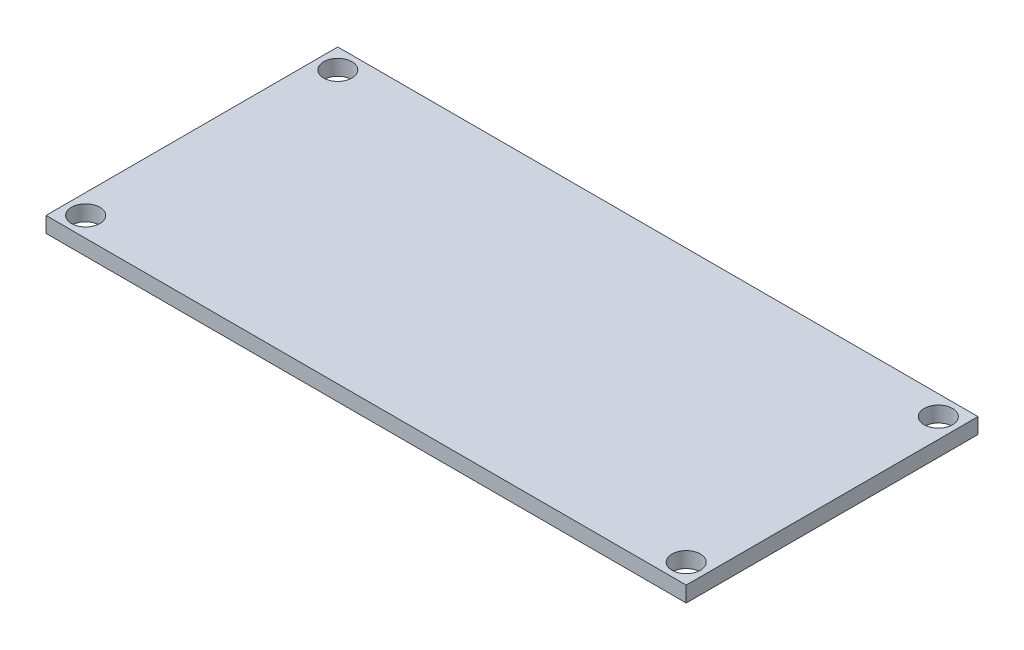
ISO-10303-21;
HEADER;
FILE_DESCRIPTION(('STEP AP214'),'2;1');
FILE_NAME('part.step','',(''),(''),'','','');
FILE_SCHEMA(('AUTOMOTIVE_DESIGN { 1 0 10303 214 1 1 1 1 }'));
ENDSEC;
DATA;
#1=APPLICATION_CONTEXT('core data for automotive mechanical design processes');
#2=APPLICATION_PROTOCOL_DEFINITION('international standard','automotive_design',2000,#1);
#3=PRODUCT_CONTEXT('',#1,'mechanical');
#4=PRODUCT('Part','Part','',(#3));
#5=PRODUCT_RELATED_PRODUCT_CATEGORY('part','',(#4));
#6=PRODUCT_DEFINITION_FORMATION('','',#4);
#7=PRODUCT_DEFINITION_CONTEXT('part definition',#1,'design');
#8=PRODUCT_DEFINITION('design','',#6,#7);
#9=PRODUCT_DEFINITION_SHAPE('','',#8);
#10=(LENGTH_UNIT() NAMED_UNIT(*) SI_UNIT(.MILLI.,.METRE.));
#11=(NAMED_UNIT(*) PLANE_ANGLE_UNIT() SI_UNIT($,.RADIAN.));
#12=(NAMED_UNIT(*) SI_UNIT($,.STERADIAN.) SOLID_ANGLE_UNIT());
#13=UNCERTAINTY_MEASURE_WITH_UNIT(LENGTH_MEASURE(1.E-05),#10,'distance_accuracy_value','');
#14=(GEOMETRIC_REPRESENTATION_CONTEXT(3) GLOBAL_UNCERTAINTY_ASSIGNED_CONTEXT((#13)) GLOBAL_UNIT_ASSIGNED_CONTEXT((#10,
#11,#12)) REPRESENTATION_CONTEXT('',''));
#15=CARTESIAN_POINT('',(0.,0.,0.));
#16=DIRECTION('',(0.,0.,1.));
#17=DIRECTION('',(1.,0.,0.));
#18=AXIS2_PLACEMENT_3D('',#15,#16,#17);
#19=CARTESIAN_POINT('',(-22.6,1.1,10.3));
#20=DIRECTION('',(1.,0.,0.));
#21=DIRECTION('',(0.,0.,-1.));
#22=AXIS2_PLACEMENT_3D('',#19,#20,#21);
#23=PLANE('',#22);
#24=DIRECTION('',(0.,0.,1.));
#25=VECTOR('',#24,1.);
#26=CARTESIAN_POINT('',(-22.6,0.,10.3));
#27=LINE('',#26,#25);
#28=CARTESIAN_POINT('',(-22.6,0.,-10.3));
#29=VERTEX_POINT('',#28);
#30=CARTESIAN_POINT('',(-22.6,0.,10.3));
#31=VERTEX_POINT('',#30);
#32=EDGE_CURVE('E102',#29,#31,#27,.T.);
#33=ORIENTED_EDGE('',*,*,#32,.T.);
#34=DIRECTION('',(0.,-1.,0.));
#35=VECTOR('',#34,1.);
#36=CARTESIAN_POINT('',(-22.6,1.1,10.3));
#37=LINE('',#36,#35);
#38=CARTESIAN_POINT('',(-22.6,1.1,10.3));
#39=VERTEX_POINT('',#38);
#40=EDGE_CURVE('E11',#39,#31,#37,.T.);
#41=ORIENTED_EDGE('',*,*,#40,.F.);
#42=DIRECTION('',(0.,0.,1.));
#43=VECTOR('',#42,1.);
#44=CARTESIAN_POINT('',(-22.6,1.1,10.3));
#45=LINE('',#44,#43);
#46=CARTESIAN_POINT('',(-22.6,1.1,-10.3));
#47=VERTEX_POINT('',#46);
#48=EDGE_CURVE('E90',#47,#39,#45,.T.);
#49=ORIENTED_EDGE('',*,*,#48,.F.);
#50=DIRECTION('',(0.,-1.,0.));
#51=VECTOR('',#50,1.);
#52=CARTESIAN_POINT('',(-22.6,1.1,-10.3));
#53=LINE('',#52,#51);
#54=EDGE_CURVE('E98',#47,#29,#53,.T.);
#55=ORIENTED_EDGE('',*,*,#54,.T.);
#56=EDGE_LOOP('',(#33,#41,#49,#55));
#57=FACE_BOUND('',#56,.T.);
#58=ADVANCED_FACE('F39',(#57),#23,.F.);
#59=CARTESIAN_POINT('',(22.6,1.1,10.3));
#60=DIRECTION('',(0.,0.,-1.));
#61=DIRECTION('',(-1.,0.,0.));
#62=AXIS2_PLACEMENT_3D('',#59,#60,#61);
#63=PLANE('',#62);
#64=DIRECTION('',(1.,0.,0.));
#65=VECTOR('',#64,1.);
#66=CARTESIAN_POINT('',(22.6,0.,10.3));
#67=LINE('',#66,#65);
#68=CARTESIAN_POINT('',(22.6,0.,10.3));
#69=VERTEX_POINT('',#68);
#70=EDGE_CURVE('E94',#31,#69,#67,.T.);
#71=ORIENTED_EDGE('',*,*,#70,.T.);
#72=DIRECTION('',(0.,-1.,0.));
#73=VECTOR('',#72,1.);
#74=CARTESIAN_POINT('',(22.6,1.1,10.3));
#75=LINE('',#74,#73);
#76=CARTESIAN_POINT('',(22.6,1.1,10.3));
#77=VERTEX_POINT('',#76);
#78=EDGE_CURVE('E47',#77,#69,#75,.T.);
#79=ORIENTED_EDGE('',*,*,#78,.F.);
#80=DIRECTION('',(1.,0.,0.));
#81=VECTOR('',#80,1.);
#82=CARTESIAN_POINT('',(22.6,1.1,10.3));
#83=LINE('',#82,#81);
#84=EDGE_CURVE('E85',#39,#77,#83,.T.);
#85=ORIENTED_EDGE('',*,*,#84,.F.);
#86=ORIENTED_EDGE('',*,*,#40,.T.);
#87=EDGE_LOOP('',(#71,#79,#85,#86));
#88=FACE_BOUND('',#87,.T.);
#89=ADVANCED_FACE('F93',(#88),#63,.F.);
#90=CARTESIAN_POINT('',(22.6,1.1,10.3));
#91=DIRECTION('',(-1.,0.,0.));
#92=DIRECTION('',(0.,0.,1.));
#93=AXIS2_PLACEMENT_3D('',#90,#91,#92);
#94=PLANE('',#93);
#95=DIRECTION('',(0.,0.,-1.));
#96=VECTOR('',#95,1.);
#97=CARTESIAN_POINT('',(22.6,0.,10.3));
#98=LINE('',#97,#96);
#99=CARTESIAN_POINT('',(22.6,0.,-10.3));
#100=VERTEX_POINT('',#99);
#101=EDGE_CURVE('E72',#69,#100,#98,.T.);
#102=ORIENTED_EDGE('',*,*,#101,.T.);
#103=DIRECTION('',(0.,-1.,0.));
#104=VECTOR('',#103,1.);
#105=CARTESIAN_POINT('',(22.6,1.1,-10.3));
#106=LINE('',#105,#104);
#107=CARTESIAN_POINT('',(22.6,1.1,-10.3));
#108=VERTEX_POINT('',#107);
#109=EDGE_CURVE('E95',#108,#100,#106,.T.);
#110=ORIENTED_EDGE('',*,*,#109,.F.);
#111=DIRECTION('',(0.,0.,-1.));
#112=VECTOR('',#111,1.);
#113=CARTESIAN_POINT('',(22.6,1.1,10.3));
#114=LINE('',#113,#112);
#115=EDGE_CURVE('E88',#77,#108,#114,.T.);
#116=ORIENTED_EDGE('',*,*,#115,.F.);
#117=ORIENTED_EDGE('',*,*,#78,.T.);
#118=EDGE_LOOP('',(#102,#110,#116,#117));
#119=FACE_BOUND('',#118,.T.);
#120=ADVANCED_FACE('F96',(#119),#94,.F.);
#121=CARTESIAN_POINT('',(22.6,1.1,-10.3));
#122=DIRECTION('',(0.,0.,1.));
#123=DIRECTION('',(1.,0.,0.));
#124=AXIS2_PLACEMENT_3D('',#121,#122,#123);
#125=PLANE('',#124);
#126=DIRECTION('',(-1.,0.,0.));
#127=VECTOR('',#126,1.);
#128=CARTESIAN_POINT('',(22.6,0.,-10.3));
#129=LINE('',#128,#127);
#130=EDGE_CURVE('E78',#100,#29,#129,.T.);
#131=ORIENTED_EDGE('',*,*,#130,.T.);
#132=ORIENTED_EDGE('',*,*,#54,.F.);
#133=DIRECTION('',(-1.,0.,0.));
#134=VECTOR('',#133,1.);
#135=CARTESIAN_POINT('',(22.6,1.1,-10.3));
#136=LINE('',#135,#134);
#137=EDGE_CURVE('E55',#108,#47,#136,.T.);
#138=ORIENTED_EDGE('',*,*,#137,.F.);
#139=ORIENTED_EDGE('',*,*,#109,.T.);
#140=EDGE_LOOP('',(#131,#132,#138,#139));
#141=FACE_BOUND('',#140,.T.);
#142=ADVANCED_FACE('F110',(#141),#125,.F.);
#143=CARTESIAN_POINT('',(0.,1.1,0.));
#144=DIRECTION('',(0.,1.,0.));
#145=DIRECTION('',(0.,0.,1.));
#146=AXIS2_PLACEMENT_3D('',#143,#144,#145);
#147=PLANE('',#146);
#148=CARTESIAN_POINT('',(-21.2,1.1,-8.90000000000001));
#149=DIRECTION('',(0.,-1.,0.));
#150=DIRECTION('',(0.,0.,1.));
#151=AXIS2_PLACEMENT_3D('',#148,#149,#150);
#152=CIRCLE('',#151,1.);
#153=CARTESIAN_POINT('',(-21.2,1.1,-7.90000000000001));
#154=VERTEX_POINT('',#153);
#155=EDGE_CURVE('E134',#154,#154,#152,.T.);
#156=ORIENTED_EDGE('',*,*,#155,.T.);
#157=EDGE_LOOP('',(#156));
#158=FACE_BOUND('',#157,.T.);
#159=CARTESIAN_POINT('',(21.2,1.1,8.90000000000001));
#160=DIRECTION('',(0.,-1.,0.));
#161=DIRECTION('',(0.,0.,1.));
#162=AXIS2_PLACEMENT_3D('',#159,#160,#161);
#163=CIRCLE('',#162,1.);
#164=CARTESIAN_POINT('',(21.2,1.1,9.90000000000001));
#165=VERTEX_POINT('',#164);
#166=EDGE_CURVE('E128',#165,#165,#163,.T.);
#167=ORIENTED_EDGE('',*,*,#166,.T.);
#168=EDGE_LOOP('',(#167));
#169=FACE_BOUND('',#168,.T.);
#170=CARTESIAN_POINT('',(21.2,1.1,-8.90000000000001));
#171=DIRECTION('',(0.,1.,0.));
#172=DIRECTION('',(0.,0.,1.));
#173=AXIS2_PLACEMENT_3D('',#170,#171,#172);
#174=CIRCLE('',#173,1.);
#175=CARTESIAN_POINT('',(21.2,1.1,-7.90000000000001));
#176=VERTEX_POINT('',#175);
#177=EDGE_CURVE('E123',#176,#176,#174,.T.);
#178=ORIENTED_EDGE('',*,*,#177,.F.);
#179=EDGE_LOOP('',(#178));
#180=FACE_BOUND('',#179,.T.);
#181=CARTESIAN_POINT('',(-21.2,1.1,8.90000000000001));
#182=DIRECTION('',(0.,1.,0.));
#183=DIRECTION('',(0.,0.,1.));
#184=AXIS2_PLACEMENT_3D('',#181,#182,#183);
#185=CIRCLE('',#184,1.);
#186=CARTESIAN_POINT('',(-21.2,1.1,9.90000000000001));
#187=VERTEX_POINT('',#186);
#188=EDGE_CURVE('E116',#187,#187,#185,.T.);
#189=ORIENTED_EDGE('',*,*,#188,.F.);
#190=EDGE_LOOP('',(#189));
#191=FACE_BOUND('',#190,.T.);
#192=ORIENTED_EDGE('',*,*,#48,.T.);
#193=ORIENTED_EDGE('',*,*,#84,.T.);
#194=ORIENTED_EDGE('',*,*,#115,.T.);
#195=ORIENTED_EDGE('',*,*,#137,.T.);
#196=EDGE_LOOP('',(#192,#193,#194,#195));
#197=FACE_BOUND('',#196,.T.);
#198=ADVANCED_FACE('F86',(#158,#169,#180,#191,#197),#147,.T.);
#199=CARTESIAN_POINT('',(0.,0.,0.));
#200=DIRECTION('',(0.,1.,0.));
#201=DIRECTION('',(0.,0.,1.));
#202=AXIS2_PLACEMENT_3D('',#199,#200,#201);
#203=PLANE('',#202);
#204=CARTESIAN_POINT('',(-21.2,0.,-8.90000000000001));
#205=DIRECTION('',(0.,-1.,0.));
#206=DIRECTION('',(0.,0.,1.));
#207=AXIS2_PLACEMENT_3D('',#204,#205,#206);
#208=CIRCLE('',#207,1.);
#209=CARTESIAN_POINT('',(-21.2,0.,-7.90000000000001));
#210=VERTEX_POINT('',#209);
#211=EDGE_CURVE('E120',#210,#210,#208,.T.);
#212=ORIENTED_EDGE('',*,*,#211,.F.);
#213=EDGE_LOOP('',(#212));
#214=FACE_BOUND('',#213,.T.);
#215=CARTESIAN_POINT('',(21.2,0.,8.90000000000001));
#216=DIRECTION('',(0.,-1.,0.));
#217=DIRECTION('',(0.,0.,1.));
#218=AXIS2_PLACEMENT_3D('',#215,#216,#217);
#219=CIRCLE('',#218,1.);
#220=CARTESIAN_POINT('',(21.2,0.,9.90000000000001));
#221=VERTEX_POINT('',#220);
#222=EDGE_CURVE('E131',#221,#221,#219,.T.);
#223=ORIENTED_EDGE('',*,*,#222,.F.);
#224=EDGE_LOOP('',(#223));
#225=FACE_BOUND('',#224,.T.);
#226=CARTESIAN_POINT('',(21.2,0.,-8.90000000000001));
#227=DIRECTION('',(0.,1.,0.));
#228=DIRECTION('',(0.,0.,1.));
#229=AXIS2_PLACEMENT_3D('',#226,#227,#228);
#230=CIRCLE('',#229,1.);
#231=CARTESIAN_POINT('',(21.2,0.,-7.90000000000001));
#232=VERTEX_POINT('',#231);
#233=EDGE_CURVE('E105',#232,#232,#230,.T.);
#234=ORIENTED_EDGE('',*,*,#233,.T.);
#235=EDGE_LOOP('',(#234));
#236=FACE_BOUND('',#235,.T.);
#237=CARTESIAN_POINT('',(-21.2,0.,8.90000000000001));
#238=DIRECTION('',(0.,1.,0.));
#239=DIRECTION('',(0.,0.,1.));
#240=AXIS2_PLACEMENT_3D('',#237,#238,#239);
#241=CIRCLE('',#240,1.);
#242=CARTESIAN_POINT('',(-21.2,0.,9.90000000000001));
#243=VERTEX_POINT('',#242);
#244=EDGE_CURVE('E119',#243,#243,#241,.T.);
#245=ORIENTED_EDGE('',*,*,#244,.T.);
#246=EDGE_LOOP('',(#245));
#247=FACE_BOUND('',#246,.T.);
#248=ORIENTED_EDGE('',*,*,#32,.F.);
#249=ORIENTED_EDGE('',*,*,#130,.F.);
#250=ORIENTED_EDGE('',*,*,#101,.F.);
#251=ORIENTED_EDGE('',*,*,#70,.F.);
#252=EDGE_LOOP('',(#248,#249,#250,#251));
#253=FACE_BOUND('',#252,.T.);
#254=ADVANCED_FACE('F113',(#214,#225,#236,#247,#253),#203,.F.);
#255=CARTESIAN_POINT('',(-21.2,0.,8.90000000000001));
#256=DIRECTION('',(0.,1.,0.));
#257=DIRECTION('',(0.,0.,1.));
#258=AXIS2_PLACEMENT_3D('',#255,#256,#257);
#259=CYLINDRICAL_SURFACE('',#258,1.);
#260=ORIENTED_EDGE('',*,*,#244,.F.);
#261=EDGE_LOOP('',(#260));
#262=FACE_BOUND('',#261,.T.);
#263=ORIENTED_EDGE('',*,*,#188,.T.);
#264=EDGE_LOOP('',(#263));
#265=FACE_BOUND('',#264,.T.);
#266=ADVANCED_FACE('F145',(#262,#265),#259,.F.);
#267=CARTESIAN_POINT('',(21.2,0.,-8.90000000000001));
#268=DIRECTION('',(0.,1.,0.));
#269=DIRECTION('',(0.,0.,1.));
#270=AXIS2_PLACEMENT_3D('',#267,#268,#269);
#271=CYLINDRICAL_SURFACE('',#270,1.);
#272=ORIENTED_EDGE('',*,*,#233,.F.);
#273=EDGE_LOOP('',(#272));
#274=FACE_BOUND('',#273,.T.);
#275=ORIENTED_EDGE('',*,*,#177,.T.);
#276=EDGE_LOOP('',(#275));
#277=FACE_BOUND('',#276,.T.);
#278=ADVANCED_FACE('F155',(#274,#277),#271,.F.);
#279=CARTESIAN_POINT('',(21.2,0.,8.90000000000001));
#280=DIRECTION('',(0.,1.,0.));
#281=DIRECTION('',(0.,0.,1.));
#282=AXIS2_PLACEMENT_3D('',#279,#280,#281);
#283=CYLINDRICAL_SURFACE('',#282,1.);
#284=ORIENTED_EDGE('',*,*,#222,.T.);
#285=EDGE_LOOP('',(#284));
#286=FACE_BOUND('',#285,.T.);
#287=ORIENTED_EDGE('',*,*,#166,.F.);
#288=EDGE_LOOP('',(#287));
#289=FACE_BOUND('',#288,.T.);
#290=ADVANCED_FACE('F203',(#286,#289),#283,.F.);
#291=CARTESIAN_POINT('',(-21.2,0.,-8.90000000000001));
#292=DIRECTION('',(0.,1.,0.));
#293=DIRECTION('',(0.,0.,1.));
#294=AXIS2_PLACEMENT_3D('',#291,#292,#293);
#295=CYLINDRICAL_SURFACE('',#294,1.);
#296=ORIENTED_EDGE('',*,*,#211,.T.);
#297=EDGE_LOOP('',(#296));
#298=FACE_BOUND('',#297,.T.);
#299=ORIENTED_EDGE('',*,*,#155,.F.);
#300=EDGE_LOOP('',(#299));
#301=FACE_BOUND('',#300,.T.);
#302=ADVANCED_FACE('F140',(#298,#301),#295,.F.);
#303=CLOSED_SHELL('',(#58,#89,#120,#142,#198,#254,#266,#278,#290,#302));
#304=MANIFOLD_SOLID_BREP('B2',#303);
#305=ADVANCED_BREP_SHAPE_REPRESENTATION('',(#18,#304),#14);
#306=SHAPE_DEFINITION_REPRESENTATION(#9,#305);
ENDSEC;
END-ISO-10303-21;
